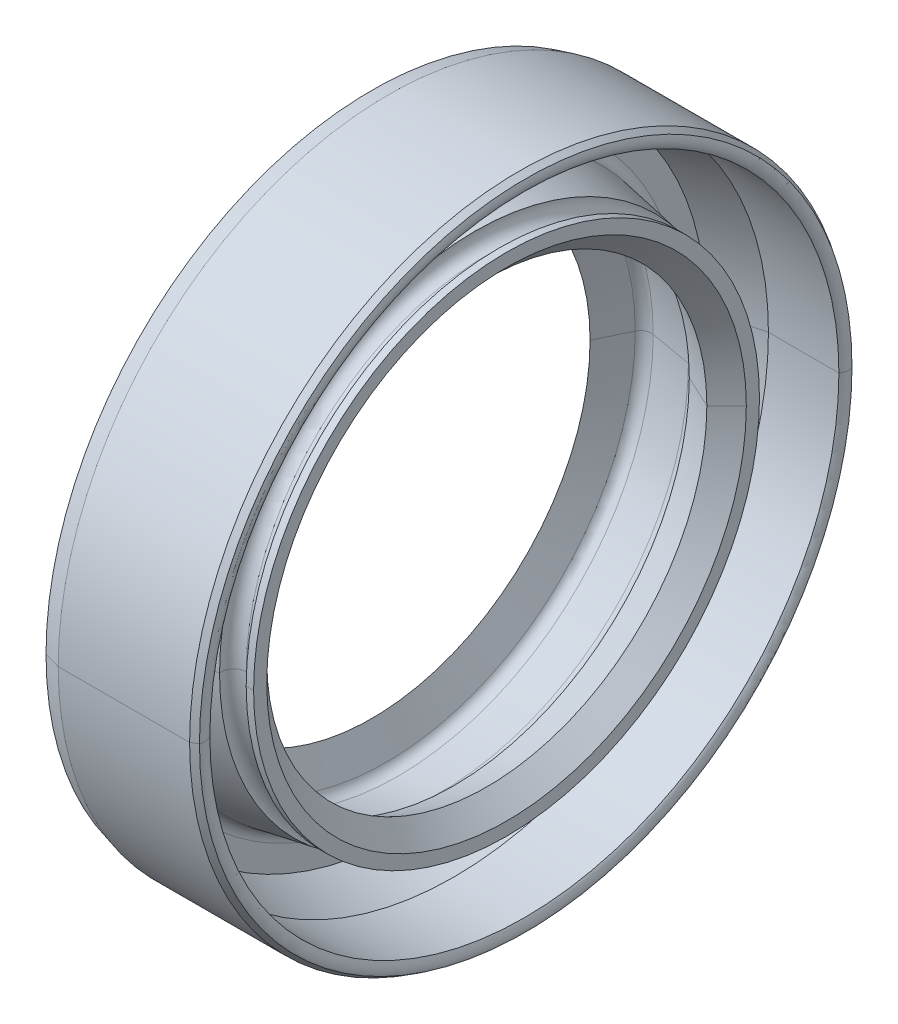
ISO-10303-21;
HEADER;
FILE_DESCRIPTION(('STEP AP214'),'2;1');
FILE_NAME('part.step','',(''),(''),'','','');
FILE_SCHEMA(('AUTOMOTIVE_DESIGN { 1 0 10303 214 1 1 1 1 }'));
ENDSEC;
DATA;
#1=APPLICATION_CONTEXT('core data for automotive mechanical design processes');
#2=APPLICATION_PROTOCOL_DEFINITION('international standard','automotive_design',2000,#1);
#3=PRODUCT_CONTEXT('',#1,'mechanical');
#4=PRODUCT('Part','Part','',(#3));
#5=PRODUCT_RELATED_PRODUCT_CATEGORY('part','',(#4));
#6=PRODUCT_DEFINITION_FORMATION('','',#4);
#7=PRODUCT_DEFINITION_CONTEXT('part definition',#1,'design');
#8=PRODUCT_DEFINITION('design','',#6,#7);
#9=PRODUCT_DEFINITION_SHAPE('','',#8);
#10=(LENGTH_UNIT() NAMED_UNIT(*) SI_UNIT(.MILLI.,.METRE.));
#11=(NAMED_UNIT(*) PLANE_ANGLE_UNIT() SI_UNIT($,.RADIAN.));
#12=(NAMED_UNIT(*) SI_UNIT($,.STERADIAN.) SOLID_ANGLE_UNIT());
#13=UNCERTAINTY_MEASURE_WITH_UNIT(LENGTH_MEASURE(1.E-05),#10,'distance_accuracy_value','');
#14=(GEOMETRIC_REPRESENTATION_CONTEXT(3) GLOBAL_UNCERTAINTY_ASSIGNED_CONTEXT((#13)) GLOBAL_UNIT_ASSIGNED_CONTEXT((#10,
#11,#12)) REPRESENTATION_CONTEXT('',''));
#15=CARTESIAN_POINT('',(0.,0.,0.));
#16=DIRECTION('',(0.,0.,1.));
#17=DIRECTION('',(1.,0.,0.));
#18=AXIS2_PLACEMENT_3D('',#15,#16,#17);
#19=CARTESIAN_POINT('',(0.752354754295494,0.,0.));
#20=DIRECTION('',(1.,0.,0.));
#21=DIRECTION('',(0.,0.,-1.));
#22=AXIS2_PLACEMENT_3D('',#19,#20,#21);
#23=CONICAL_SURFACE('',#22,15.,0.260113068736245);
#24=DIRECTION('',(0.966360904184034,0.,0.257189818742141));
#25=VECTOR('',#24,1.);
#26=CARTESIAN_POINT('',(0.752354754295494,0.,15.));
#27=LINE('',#26,#25);
#28=CARTESIAN_POINT('',(0.,0.,14.7997663377634));
#29=VERTEX_POINT('',#28);
#30=CARTESIAN_POINT('',(0.752354754295494,0.,15.));
#31=VERTEX_POINT('',#30);
#32=EDGE_CURVE('E222',#29,#31,#27,.T.);
#33=ORIENTED_EDGE('',*,*,#32,.F.);
#34=CARTESIAN_POINT('',(0.,0.,0.));
#35=DIRECTION('',(-1.,0.,0.));
#36=DIRECTION('',(0.,0.,1.));
#37=AXIS2_PLACEMENT_3D('',#34,#35,#36);
#38=CIRCLE('',#37,14.7997663377634);
#39=CARTESIAN_POINT('',(0.,0.,-14.7997663377634));
#40=VERTEX_POINT('',#39);
#41=EDGE_CURVE('E11',#40,#29,#38,.T.);
#42=ORIENTED_EDGE('',*,*,#41,.F.);
#43=DIRECTION('',(0.966360904184034,0.,-0.257189818742141));
#44=VECTOR('',#43,1.);
#45=CARTESIAN_POINT('',(0.752354754295494,0.,-15.));
#46=LINE('',#45,#44);
#47=CARTESIAN_POINT('',(0.752354754295494,0.,-15.));
#48=VERTEX_POINT('',#47);
#49=EDGE_CURVE('E396',#40,#48,#46,.T.);
#50=ORIENTED_EDGE('',*,*,#49,.T.);
#51=CARTESIAN_POINT('',(0.752354754295494,0.,0.));
#52=DIRECTION('',(-1.,0.,0.));
#53=DIRECTION('',(0.,0.,1.));
#54=AXIS2_PLACEMENT_3D('',#51,#52,#53);
#55=CIRCLE('',#54,15.);
#56=EDGE_CURVE('E315',#48,#31,#55,.T.);
#57=ORIENTED_EDGE('',*,*,#56,.T.);
#58=EDGE_LOOP('',(#33,#42,#50,#57));
#59=FACE_BOUND('',#58,.T.);
#60=ADVANCED_FACE('F17',(#59),#23,.T.);
#61=CARTESIAN_POINT('',(0.,0.,-14.7997663377634));
#62=DIRECTION('',(1.,0.,0.));
#63=DIRECTION('',(0.,1.,0.));
#64=AXIS2_PLACEMENT_3D('',#61,#62,#63);
#65=PLANE('',#64);
#66=CARTESIAN_POINT('',(0.,0.,0.));
#67=DIRECTION('',(-1.,0.,0.));
#68=DIRECTION('',(0.,0.,1.));
#69=AXIS2_PLACEMENT_3D('',#66,#67,#68);
#70=CIRCLE('',#69,9.92474243623592);
#71=CARTESIAN_POINT('',(0.,0.,-9.92474243623592));
#72=VERTEX_POINT('',#71);
#73=CARTESIAN_POINT('',(0.,0.,9.92474243623592));
#74=VERTEX_POINT('',#73);
#75=EDGE_CURVE('E372',#72,#74,#70,.T.);
#76=ORIENTED_EDGE('',*,*,#75,.F.);
#77=CARTESIAN_POINT('',(0.,0.,0.));
#78=DIRECTION('',(-1.,0.,0.));
#79=DIRECTION('',(0.,0.,1.));
#80=AXIS2_PLACEMENT_3D('',#77,#78,#79);
#81=CIRCLE('',#80,9.92474243623592);
#82=EDGE_CURVE('E28',#74,#72,#81,.T.);
#83=ORIENTED_EDGE('',*,*,#82,.F.);
#84=EDGE_LOOP('',(#76,#83));
#85=FACE_BOUND('',#84,.T.);
#86=ORIENTED_EDGE('',*,*,#41,.T.);
#87=CARTESIAN_POINT('',(0.,0.,0.));
#88=DIRECTION('',(-1.,0.,0.));
#89=DIRECTION('',(0.,0.,1.));
#90=AXIS2_PLACEMENT_3D('',#87,#88,#89);
#91=CIRCLE('',#90,14.7997663377634);
#92=EDGE_CURVE('E227',#29,#40,#91,.T.);
#93=ORIENTED_EDGE('',*,*,#92,.T.);
#94=EDGE_LOOP('',(#86,#93));
#95=FACE_BOUND('',#94,.T.);
#96=ADVANCED_FACE('F514',(#85,#95),#65,.F.);
#97=CARTESIAN_POINT('',(0.,0.,0.));
#98=DIRECTION('',(1.,0.,0.));
#99=DIRECTION('',(0.,0.,-1.));
#100=AXIS2_PLACEMENT_3D('',#97,#98,#99);
#101=CONICAL_SURFACE('',#100,9.92474243623592,1.1278205147707);
#102=DIRECTION('',(0.428629946027667,0.,0.903480143317117));
#103=VECTOR('',#102,1.);
#104=CARTESIAN_POINT('',(0.,0.,9.92474243623592));
#105=LINE('',#104,#103);
#106=CARTESIAN_POINT('',(0.659888848220738,0.,11.3156776163116));
#107=VERTEX_POINT('',#106);
#108=EDGE_CURVE('E368',#74,#107,#105,.T.);
#109=ORIENTED_EDGE('',*,*,#108,.F.);
#110=ORIENTED_EDGE('',*,*,#82,.T.);
#111=DIRECTION('',(0.428629946027667,0.,-0.903480143317117));
#112=VECTOR('',#111,1.);
#113=CARTESIAN_POINT('',(0.,0.,-9.92474243623592));
#114=LINE('',#113,#112);
#115=CARTESIAN_POINT('',(0.659888848220738,0.,-11.3156776163116));
#116=VERTEX_POINT('',#115);
#117=EDGE_CURVE('E236',#72,#116,#114,.T.);
#118=ORIENTED_EDGE('',*,*,#117,.T.);
#119=CARTESIAN_POINT('',(0.659888848220738,0.,0.));
#120=DIRECTION('',(-1.,0.,0.));
#121=DIRECTION('',(0.,0.,1.));
#122=AXIS2_PLACEMENT_3D('',#119,#120,#121);
#123=CIRCLE('',#122,11.3156776163116);
#124=EDGE_CURVE('E367',#107,#116,#123,.T.);
#125=ORIENTED_EDGE('',*,*,#124,.F.);
#126=EDGE_LOOP('',(#109,#110,#118,#125));
#127=FACE_BOUND('',#126,.T.);
#128=ADVANCED_FACE('F512',(#127),#101,.F.);
#129=CARTESIAN_POINT('',(1.1116289198793,0.,0.));
#130=DIRECTION('',(-1.,0.,0.));
#131=DIRECTION('',(0.,0.,1.));
#132=AXIS2_PLACEMENT_3D('',#129,#130,#131);
#133=TOROIDAL_SURFACE('',#132,11.1013626432978,0.5);
#134=CARTESIAN_POINT('',(1.1116289198793,0.,-11.1013626432978));
#135=DIRECTION('',(0.,1.,0.));
#136=DIRECTION('',(0.,0.,1.));
#137=AXIS2_PLACEMENT_3D('',#134,#135,#136);
#138=CIRCLE('',#137,0.5);
#139=CARTESIAN_POINT('',(1.19845300871272,0.,-11.5937665198039));
#140=VERTEX_POINT('',#139);
#141=EDGE_CURVE('E235',#140,#116,#138,.T.);
#142=ORIENTED_EDGE('',*,*,#141,.F.);
#143=CARTESIAN_POINT('',(1.19845300871272,0.,0.));
#144=DIRECTION('',(-1.,0.,0.));
#145=DIRECTION('',(0.,0.,1.));
#146=AXIS2_PLACEMENT_3D('',#143,#144,#145);
#147=CIRCLE('',#146,11.5937665198039);
#148=CARTESIAN_POINT('',(1.19845300871272,0.,11.5937665198039));
#149=VERTEX_POINT('',#148);
#150=EDGE_CURVE('E363',#149,#140,#147,.T.);
#151=ORIENTED_EDGE('',*,*,#150,.F.);
#152=CARTESIAN_POINT('',(1.1116289198793,0.,11.1013626432978));
#153=DIRECTION('',(0.,-1.,0.));
#154=DIRECTION('',(0.,0.,-1.));
#155=AXIS2_PLACEMENT_3D('',#152,#153,#154);
#156=CIRCLE('',#155,0.5);
#157=EDGE_CURVE('E215',#149,#107,#156,.T.);
#158=ORIENTED_EDGE('',*,*,#157,.T.);
#159=ORIENTED_EDGE('',*,*,#124,.T.);
#160=EDGE_LOOP('',(#142,#151,#158,#159));
#161=FACE_BOUND('',#160,.T.);
#162=ADVANCED_FACE('F497',(#161),#133,.F.);
#163=CARTESIAN_POINT('',(1.19845300871272,0.,0.));
#164=DIRECTION('',(-1.,0.,0.));
#165=DIRECTION('',(0.,0.,1.));
#166=AXIS2_PLACEMENT_3D('',#163,#164,#165);
#167=CONICAL_SURFACE('',#166,11.5937665198039,0.17453292519935);
#168=DIRECTION('',(-0.984807753012222,0.,-0.173648177666849));
#169=VECTOR('',#168,1.);
#170=CARTESIAN_POINT('',(1.19845300871272,0.,-11.5937665198039));
#171=LINE('',#170,#169);
#172=CARTESIAN_POINT('',(3.14131146181692,0.,-11.2511881548243));
#173=VERTEX_POINT('',#172);
#174=EDGE_CURVE('E214',#173,#140,#171,.T.);
#175=ORIENTED_EDGE('',*,*,#174,.F.);
#176=CARTESIAN_POINT('',(3.14131146181692,0.,0.));
#177=DIRECTION('',(-1.,0.,0.));
#178=DIRECTION('',(0.,0.,1.));
#179=AXIS2_PLACEMENT_3D('',#176,#177,#178);
#180=CIRCLE('',#179,11.2511881548243);
#181=CARTESIAN_POINT('',(3.14131146181692,0.,11.2511881548243));
#182=VERTEX_POINT('',#181);
#183=EDGE_CURVE('E327',#182,#173,#180,.T.);
#184=ORIENTED_EDGE('',*,*,#183,.F.);
#185=DIRECTION('',(-0.984807753012222,0.,0.173648177666849));
#186=VECTOR('',#185,1.);
#187=CARTESIAN_POINT('',(1.19845300871272,0.,11.5937665198039));
#188=LINE('',#187,#186);
#189=EDGE_CURVE('E328',#182,#149,#188,.T.);
#190=ORIENTED_EDGE('',*,*,#189,.T.);
#191=ORIENTED_EDGE('',*,*,#150,.T.);
#192=EDGE_LOOP('',(#175,#184,#190,#191));
#193=FACE_BOUND('',#192,.T.);
#194=ADVANCED_FACE('F487',(#193),#167,.F.);
#195=CARTESIAN_POINT('',(3.01154726943575,0.,0.));
#196=DIRECTION('',(-1.,0.,0.));
#197=DIRECTION('',(0.,0.,1.));
#198=AXIS2_PLACEMENT_3D('',#195,#196,#197);
#199=TOROIDAL_SURFACE('',#198,10.5152588497367,0.747282200852594);
#200=CARTESIAN_POINT('',(3.01154726943575,0.,-10.5152588497367));
#201=DIRECTION('',(0.,1.,0.));
#202=DIRECTION('',(0.,0.,1.));
#203=AXIS2_PLACEMENT_3D('',#200,#201,#202);
#204=CIRCLE('',#203,0.747282200852594);
#205=CARTESIAN_POINT('',(3.73641100426286,0.,-10.696926826121));
#206=VERTEX_POINT('',#205);
#207=EDGE_CURVE('E392',#206,#173,#204,.T.);
#208=ORIENTED_EDGE('',*,*,#207,.F.);
#209=CARTESIAN_POINT('',(3.73641100426286,0.,0.));
#210=DIRECTION('',(-1.,0.,0.));
#211=DIRECTION('',(0.,0.,1.));
#212=AXIS2_PLACEMENT_3D('',#209,#210,#211);
#213=CIRCLE('',#212,10.696926826121);
#214=CARTESIAN_POINT('',(3.73641100426286,0.,10.696926826121));
#215=VERTEX_POINT('',#214);
#216=EDGE_CURVE('E324',#215,#206,#213,.T.);
#217=ORIENTED_EDGE('',*,*,#216,.F.);
#218=CARTESIAN_POINT('',(3.01154726943575,0.,10.5152588497367));
#219=DIRECTION('',(0.,-1.,0.));
#220=DIRECTION('',(0.,0.,-1.));
#221=AXIS2_PLACEMENT_3D('',#218,#219,#220);
#222=CIRCLE('',#221,0.747282200852594);
#223=EDGE_CURVE('E300',#215,#182,#222,.T.);
#224=ORIENTED_EDGE('',*,*,#223,.T.);
#225=ORIENTED_EDGE('',*,*,#183,.T.);
#226=EDGE_LOOP('',(#208,#217,#224,#225));
#227=FACE_BOUND('',#226,.T.);
#228=ADVANCED_FACE('F549',(#227),#199,.F.);
#229=CARTESIAN_POINT('',(3.73641100426286,0.,0.));
#230=DIRECTION('',(-1.,0.,0.));
#231=DIRECTION('',(0.,0.,1.));
#232=AXIS2_PLACEMENT_3D('',#229,#230,#231);
#233=CONICAL_SURFACE('',#232,10.696926826121,0.436332312998609);
#234=DIRECTION('',(-0.906307787036639,0.,-0.422618261740724));
#235=VECTOR('',#234,1.);
#236=CARTESIAN_POINT('',(3.73641100426286,0.,-10.696926826121));
#237=LINE('',#236,#235);
#238=CARTESIAN_POINT('',(5.23097540596805,0.,-10.));
#239=VERTEX_POINT('',#238);
#240=EDGE_CURVE('E21',#239,#206,#237,.T.);
#241=ORIENTED_EDGE('',*,*,#240,.F.);
#242=CARTESIAN_POINT('',(5.23097540596805,0.,0.));
#243=DIRECTION('',(-1.,0.,0.));
#244=DIRECTION('',(0.,0.,1.));
#245=AXIS2_PLACEMENT_3D('',#242,#243,#244);
#246=CIRCLE('',#245,10.);
#247=CARTESIAN_POINT('',(5.23097540596805,0.,10.));
#248=VERTEX_POINT('',#247);
#249=EDGE_CURVE('E185',#248,#239,#246,.T.);
#250=ORIENTED_EDGE('',*,*,#249,.F.);
#251=DIRECTION('',(-0.906307787036639,0.,0.422618261740724));
#252=VECTOR('',#251,1.);
#253=CARTESIAN_POINT('',(3.73641100426286,0.,10.696926826121));
#254=LINE('',#253,#252);
#255=EDGE_CURVE('E206',#248,#215,#254,.T.);
#256=ORIENTED_EDGE('',*,*,#255,.T.);
#257=ORIENTED_EDGE('',*,*,#216,.T.);
#258=EDGE_LOOP('',(#241,#250,#256,#257));
#259=FACE_BOUND('',#258,.T.);
#260=ADVANCED_FACE('F552',(#259),#233,.F.);
#261=CARTESIAN_POINT('',(5.23097540596805,0.,0.));
#262=DIRECTION('',(1.,0.,0.));
#263=DIRECTION('',(0.,0.,-1.));
#264=AXIS2_PLACEMENT_3D('',#261,#262,#263);
#265=CONICAL_SURFACE('',#264,10.,0.785398163397414);
#266=DIRECTION('',(0.707106781186572,0.,0.707106781186523));
#267=VECTOR('',#266,1.);
#268=CARTESIAN_POINT('',(5.23097540596805,0.,10.));
#269=LINE('',#268,#267);
#270=CARTESIAN_POINT('',(6.1277140469912,0.,10.8967386410231));
#271=VERTEX_POINT('',#270);
#272=EDGE_CURVE('E198',#248,#271,#269,.T.);
#273=ORIENTED_EDGE('',*,*,#272,.F.);
#274=ORIENTED_EDGE('',*,*,#249,.T.);
#275=DIRECTION('',(0.707106781186572,0.,-0.707106781186523));
#276=VECTOR('',#275,1.);
#277=CARTESIAN_POINT('',(5.23097540596805,0.,-10.));
#278=LINE('',#277,#276);
#279=CARTESIAN_POINT('',(6.1277140469912,0.,-10.8967386410231));
#280=VERTEX_POINT('',#279);
#281=EDGE_CURVE('E189',#239,#280,#278,.T.);
#282=ORIENTED_EDGE('',*,*,#281,.T.);
#283=CARTESIAN_POINT('',(6.1277140469912,0.,0.));
#284=DIRECTION('',(-1.,0.,0.));
#285=DIRECTION('',(0.,0.,1.));
#286=AXIS2_PLACEMENT_3D('',#283,#284,#285);
#287=CIRCLE('',#286,10.8967386410231);
#288=EDGE_CURVE('E175',#271,#280,#287,.T.);
#289=ORIENTED_EDGE('',*,*,#288,.F.);
#290=EDGE_LOOP('',(#273,#274,#282,#289));
#291=FACE_BOUND('',#290,.T.);
#292=ADVANCED_FACE('F190',(#291),#265,.F.);
#293=CARTESIAN_POINT('',(6.1277140469912,0.,-10.8967386410231));
#294=DIRECTION('',(-1.,0.,0.));
#295=DIRECTION('',(0.,0.,1.));
#296=AXIS2_PLACEMENT_3D('',#293,#294,#295);
#297=PLANE('',#296);
#298=CARTESIAN_POINT('',(6.1277140469912,0.,0.));
#299=DIRECTION('',(-1.,0.,0.));
#300=DIRECTION('',(0.,0.,1.));
#301=AXIS2_PLACEMENT_3D('',#298,#299,#300);
#302=CIRCLE('',#301,10.8967386410231);
#303=EDGE_CURVE('E180',#280,#271,#302,.T.);
#304=ORIENTED_EDGE('',*,*,#303,.T.);
#305=ORIENTED_EDGE('',*,*,#288,.T.);
#306=EDGE_LOOP('',(#304,#305));
#307=FACE_BOUND('',#306,.T.);
#308=CARTESIAN_POINT('',(6.1277140469912,0.,0.));
#309=DIRECTION('',(-1.,0.,0.));
#310=DIRECTION('',(0.,0.,1.));
#311=AXIS2_PLACEMENT_3D('',#308,#309,#310);
#312=CIRCLE('',#311,11.494564401705);
#313=CARTESIAN_POINT('',(6.1277140469912,0.,11.494564401705));
#314=VERTEX_POINT('',#313);
#315=CARTESIAN_POINT('',(6.1277140469912,0.,-11.494564401705));
#316=VERTEX_POINT('',#315);
#317=EDGE_CURVE('E195',#314,#316,#312,.T.);
#318=ORIENTED_EDGE('',*,*,#317,.F.);
#319=CARTESIAN_POINT('',(6.1277140469912,0.,0.));
#320=DIRECTION('',(-1.,0.,0.));
#321=DIRECTION('',(0.,0.,1.));
#322=AXIS2_PLACEMENT_3D('',#319,#320,#321);
#323=CIRCLE('',#322,11.494564401705);
#324=EDGE_CURVE('E186',#316,#314,#323,.T.);
#325=ORIENTED_EDGE('',*,*,#324,.F.);
#326=EDGE_LOOP('',(#318,#325));
#327=FACE_BOUND('',#326,.T.);
#328=ADVANCED_FACE('F177',(#307,#327),#297,.F.);
#329=CARTESIAN_POINT('',(-19.4565940720075,0.,0.));
#330=DIRECTION('',(-1.,0.,0.));
#331=DIRECTION('',(0.,0.,1.));
#332=AXIS2_PLACEMENT_3D('',#329,#330,#331);
#333=CYLINDRICAL_SURFACE('',#332,11.494564401705);
#334=DIRECTION('',(-1.,0.,0.));
#335=VECTOR('',#334,1.);
#336=CARTESIAN_POINT('',(-19.4565940720075,0.,-11.494564401705));
#337=LINE('',#336,#335);
#338=CARTESIAN_POINT('',(5.7914370566075,0.,-11.4945644017061));
#339=VERTEX_POINT('',#338);
#340=EDGE_CURVE('E242',#316,#339,#337,.T.);
#341=ORIENTED_EDGE('',*,*,#340,.F.);
#342=ORIENTED_EDGE('',*,*,#324,.T.);
#343=DIRECTION('',(-1.,0.,0.));
#344=VECTOR('',#343,1.);
#345=CARTESIAN_POINT('',(-19.4565940720075,0.,11.494564401705));
#346=LINE('',#345,#344);
#347=CARTESIAN_POINT('',(5.7914370566075,0.,11.4945644017061));
#348=VERTEX_POINT('',#347);
#349=EDGE_CURVE('E241',#314,#348,#346,.T.);
#350=ORIENTED_EDGE('',*,*,#349,.T.);
#351=CARTESIAN_POINT('',(5.7914370566075,0.,0.));
#352=DIRECTION('',(-1.,0.,0.));
#353=DIRECTION('',(0.,0.,1.));
#354=AXIS2_PLACEMENT_3D('',#351,#352,#353);
#355=CIRCLE('',#354,11.494564401705);
#356=EDGE_CURVE('E340',#339,#348,#355,.T.);
#357=ORIENTED_EDGE('',*,*,#356,.F.);
#358=EDGE_LOOP('',(#341,#342,#350,#357));
#359=FACE_BOUND('',#358,.T.);
#360=ADVANCED_FACE('F606',(#359),#333,.T.);
#361=CARTESIAN_POINT('',(5.23088228864806,0.,0.));
#362=DIRECTION('',(-1.,0.,0.));
#363=DIRECTION('',(0.,0.,1.));
#364=AXIS2_PLACEMENT_3D('',#361,#362,#363);
#365=TOROIDAL_SURFACE('',#364,11.4935145071604,0.56055575116185);
#366=CARTESIAN_POINT('',(5.23088228864806,0.,0.));
#367=DIRECTION('',(-1.,0.,0.));
#368=DIRECTION('',(0.,0.,1.));
#369=AXIS2_PLACEMENT_3D('',#366,#367,#368);
#370=CIRCLE('',#369,10.9329587559985);
#371=CARTESIAN_POINT('',(5.23088228864806,0.,10.9329587559985));
#372=VERTEX_POINT('',#371);
#373=CARTESIAN_POINT('',(5.23088228864806,0.,-10.9329587559985));
#374=VERTEX_POINT('',#373);
#375=EDGE_CURVE('E273',#372,#374,#370,.T.);
#376=ORIENTED_EDGE('',*,*,#375,.F.);
#377=CARTESIAN_POINT('',(5.23088228864806,0.,11.4935145071604));
#378=DIRECTION('',(0.,-1.,0.));
#379=DIRECTION('',(0.,0.,-1.));
#380=AXIS2_PLACEMENT_3D('',#377,#378,#379);
#381=CIRCLE('',#380,0.560555751161849);
#382=EDGE_CURVE('E210',#372,#348,#381,.T.);
#383=ORIENTED_EDGE('',*,*,#382,.T.);
#384=CARTESIAN_POINT('',(5.7914370566075,0.,0.));
#385=DIRECTION('',(-1.,0.,0.));
#386=DIRECTION('',(0.,0.,1.));
#387=AXIS2_PLACEMENT_3D('',#384,#385,#386);
#388=CIRCLE('',#387,11.494564401705);
#389=EDGE_CURVE('E237',#348,#339,#388,.T.);
#390=ORIENTED_EDGE('',*,*,#389,.T.);
#391=CARTESIAN_POINT('',(5.23088228864806,0.,-11.4935145071604));
#392=DIRECTION('',(0.,1.,0.));
#393=DIRECTION('',(0.,0.,1.));
#394=AXIS2_PLACEMENT_3D('',#391,#392,#393);
#395=CIRCLE('',#394,0.560555751161849);
#396=EDGE_CURVE('E344',#374,#339,#395,.T.);
#397=ORIENTED_EDGE('',*,*,#396,.F.);
#398=EDGE_LOOP('',(#376,#383,#390,#397));
#399=FACE_BOUND('',#398,.T.);
#400=ADVANCED_FACE('F557',(#399),#365,.F.);
#401=CARTESIAN_POINT('',(4.6792624358679,0.,0.));
#402=DIRECTION('',(-1.,0.,0.));
#403=DIRECTION('',(0.,0.,1.));
#404=AXIS2_PLACEMENT_3D('',#401,#402,#403);
#405=CONICAL_SURFACE('',#404,11.5932054705393,0.174532925199549);
#406=DIRECTION('',(-0.984807753012188,0.,-0.173648177667046));
#407=VECTOR('',#406,1.);
#408=CARTESIAN_POINT('',(4.6792624358679,0.,-11.5932054705393));
#409=LINE('',#408,#407);
#410=CARTESIAN_POINT('',(4.6792624358679,0.,-11.5932054705393));
#411=VERTEX_POINT('',#410);
#412=CARTESIAN_POINT('',(1.93564869347058,0.,-12.0769785979668));
#413=VERTEX_POINT('',#412);
#414=EDGE_CURVE('E252',#411,#413,#409,.T.);
#415=ORIENTED_EDGE('',*,*,#414,.F.);
#416=CARTESIAN_POINT('',(4.6792624358679,0.,0.));
#417=DIRECTION('',(-1.,0.,0.));
#418=DIRECTION('',(0.,0.,1.));
#419=AXIS2_PLACEMENT_3D('',#416,#417,#418);
#420=CIRCLE('',#419,11.5932054705393);
#421=CARTESIAN_POINT('',(4.6792624358679,0.,11.5932054705393));
#422=VERTEX_POINT('',#421);
#423=EDGE_CURVE('E263',#411,#422,#420,.T.);
#424=ORIENTED_EDGE('',*,*,#423,.T.);
#425=DIRECTION('',(-0.984807753012188,0.,0.173648177667046));
#426=VECTOR('',#425,1.);
#427=CARTESIAN_POINT('',(4.6792624358679,0.,11.5932054705393));
#428=LINE('',#427,#426);
#429=CARTESIAN_POINT('',(1.93564869347058,0.,12.0769785979668));
#430=VERTEX_POINT('',#429);
#431=EDGE_CURVE('E251',#422,#430,#428,.T.);
#432=ORIENTED_EDGE('',*,*,#431,.T.);
#433=CARTESIAN_POINT('',(1.93564869347058,0.,0.));
#434=DIRECTION('',(-1.,0.,0.));
#435=DIRECTION('',(0.,0.,1.));
#436=AXIS2_PLACEMENT_3D('',#433,#434,#435);
#437=CIRCLE('',#436,12.0769785979668);
#438=EDGE_CURVE('E221',#413,#430,#437,.T.);
#439=ORIENTED_EDGE('',*,*,#438,.F.);
#440=EDGE_LOOP('',(#415,#424,#432,#439));
#441=FACE_BOUND('',#440,.T.);
#442=ADVANCED_FACE('F553',(#441),#405,.T.);
#443=CARTESIAN_POINT('',(2.02833740231413,0.,0.));
#444=DIRECTION('',(-1.,0.,0.));
#445=DIRECTION('',(0.,0.,1.));
#446=AXIS2_PLACEMENT_3D('',#443,#444,#445);
#447=TOROIDAL_SURFACE('',#446,12.6026423873148,0.5337730006088);
#448=CARTESIAN_POINT('',(2.02833740231413,0.,-12.6026423873148));
#449=DIRECTION('',(0.,1.,0.));
#450=DIRECTION('',(0.,0.,1.));
#451=AXIS2_PLACEMENT_3D('',#448,#449,#450);
#452=CIRCLE('',#451,0.533773000608801);
#453=CARTESIAN_POINT('',(1.49456440170533,0.,-12.602642387315));
#454=VERTEX_POINT('',#453);
#455=EDGE_CURVE('E304',#454,#413,#452,.T.);
#456=ORIENTED_EDGE('',*,*,#455,.F.);
#457=CARTESIAN_POINT('',(1.49456440170533,0.,0.));
#458=DIRECTION('',(-1.,0.,0.));
#459=DIRECTION('',(0.,0.,1.));
#460=AXIS2_PLACEMENT_3D('',#457,#458,#459);
#461=CIRCLE('',#460,12.6026423873152);
#462=CARTESIAN_POINT('',(1.49456440170533,0.,12.602642387315));
#463=VERTEX_POINT('',#462);
#464=EDGE_CURVE('E322',#463,#454,#461,.T.);
#465=ORIENTED_EDGE('',*,*,#464,.F.);
#466=CARTESIAN_POINT('',(2.02833740231413,0.,12.6026423873148));
#467=DIRECTION('',(0.,-1.,0.));
#468=DIRECTION('',(0.,0.,-1.));
#469=AXIS2_PLACEMENT_3D('',#466,#467,#468);
#470=CIRCLE('',#469,0.533773000608801);
#471=EDGE_CURVE('E217',#463,#430,#470,.T.);
#472=ORIENTED_EDGE('',*,*,#471,.T.);
#473=CARTESIAN_POINT('',(1.93564869347058,0.,0.));
#474=DIRECTION('',(-1.,0.,0.));
#475=DIRECTION('',(0.,0.,1.));
#476=AXIS2_PLACEMENT_3D('',#473,#474,#475);
#477=CIRCLE('',#476,12.0769785979668);
#478=EDGE_CURVE('E247',#430,#413,#477,.T.);
#479=ORIENTED_EDGE('',*,*,#478,.T.);
#480=EDGE_LOOP('',(#456,#465,#472,#479));
#481=FACE_BOUND('',#480,.T.);
#482=ADVANCED_FACE('F556',(#481),#447,.F.);
#483=CARTESIAN_POINT('',(1.49456440170531,0.,-13.6921931247855));
#484=DIRECTION('',(-1.,0.,0.));
#485=DIRECTION('',(0.,0.,1.));
#486=AXIS2_PLACEMENT_3D('',#483,#484,#485);
#487=PLANE('',#486);
#488=ORIENTED_EDGE('',*,*,#464,.T.);
#489=CARTESIAN_POINT('',(1.49456440170533,0.,0.));
#490=DIRECTION('',(-1.,0.,0.));
#491=DIRECTION('',(0.,0.,1.));
#492=AXIS2_PLACEMENT_3D('',#489,#490,#491);
#493=CIRCLE('',#492,12.6026423873152);
#494=EDGE_CURVE('E285',#454,#463,#493,.T.);
#495=ORIENTED_EDGE('',*,*,#494,.T.);
#496=EDGE_LOOP('',(#488,#495));
#497=FACE_BOUND('',#496,.T.);
#498=CARTESIAN_POINT('',(1.4945644017053,0.,0.));
#499=DIRECTION('',(-1.,0.,0.));
#500=DIRECTION('',(0.,0.,1.));
#501=AXIS2_PLACEMENT_3D('',#498,#499,#500);
#502=CIRCLE('',#501,13.6921931247855);
#503=CARTESIAN_POINT('',(1.4945644017053,0.,-13.6921931247855));
#504=VERTEX_POINT('',#503);
#505=CARTESIAN_POINT('',(1.4945644017053,0.,13.6921931247855));
#506=VERTEX_POINT('',#505);
#507=EDGE_CURVE('E220',#504,#506,#502,.T.);
#508=ORIENTED_EDGE('',*,*,#507,.F.);
#509=CARTESIAN_POINT('',(1.4945644017053,0.,0.));
#510=DIRECTION('',(-1.,0.,0.));
#511=DIRECTION('',(0.,0.,1.));
#512=AXIS2_PLACEMENT_3D('',#509,#510,#511);
#513=CIRCLE('',#512,13.6921931247855);
#514=EDGE_CURVE('E345',#506,#504,#513,.T.);
#515=ORIENTED_EDGE('',*,*,#514,.F.);
#516=EDGE_LOOP('',(#508,#515));
#517=FACE_BOUND('',#516,.T.);
#518=ADVANCED_FACE('F589',(#497,#517),#487,.F.);
#519=CARTESIAN_POINT('',(1.4945644017053,0.,0.));
#520=DIRECTION('',(1.,0.,0.));
#521=DIRECTION('',(0.,0.,-1.));
#522=AXIS2_PLACEMENT_3D('',#519,#520,#521);
#523=CONICAL_SURFACE('',#522,13.6921931247855,0.261799387799077);
#524=DIRECTION('',(0.965925826289087,0.,0.25881904510245));
#525=VECTOR('',#524,1.);
#526=CARTESIAN_POINT('',(1.4945644017053,0.,13.6921931247855));
#527=LINE('',#526,#525);
#528=CARTESIAN_POINT('',(3.73641100426317,0.,14.2928941114952));
#529=VERTEX_POINT('',#528);
#530=EDGE_CURVE('E316',#506,#529,#527,.T.);
#531=ORIENTED_EDGE('',*,*,#530,.F.);
#532=ORIENTED_EDGE('',*,*,#514,.T.);
#533=DIRECTION('',(0.965925826289087,0.,-0.25881904510245));
#534=VECTOR('',#533,1.);
#535=CARTESIAN_POINT('',(1.4945644017053,0.,-13.6921931247855));
#536=LINE('',#535,#534);
#537=CARTESIAN_POINT('',(3.73641100426317,0.,-14.2928941114952));
#538=VERTEX_POINT('',#537);
#539=EDGE_CURVE('E258',#504,#538,#536,.T.);
#540=ORIENTED_EDGE('',*,*,#539,.T.);
#541=CARTESIAN_POINT('',(3.73641100426317,0.,0.));
#542=DIRECTION('',(-1.,0.,0.));
#543=DIRECTION('',(0.,0.,1.));
#544=AXIS2_PLACEMENT_3D('',#541,#542,#543);
#545=CIRCLE('',#544,14.2928941114952);
#546=EDGE_CURVE('E314',#529,#538,#545,.T.);
#547=ORIENTED_EDGE('',*,*,#546,.F.);
#548=EDGE_LOOP('',(#531,#532,#540,#547));
#549=FACE_BOUND('',#548,.T.);
#550=ADVANCED_FACE('F585',(#549),#523,.F.);
#551=CARTESIAN_POINT('',(-19.4565940720075,0.,0.));
#552=DIRECTION('',(-1.,0.,0.));
#553=DIRECTION('',(0.,0.,1.));
#554=AXIS2_PLACEMENT_3D('',#551,#552,#553);
#555=CYLINDRICAL_SURFACE('',#554,14.2928941114951);
#556=DIRECTION('',(-1.,0.,0.));
#557=VECTOR('',#556,1.);
#558=CARTESIAN_POINT('',(-19.4565940720075,0.,-14.2928941114951));
#559=LINE('',#558,#557);
#560=CARTESIAN_POINT('',(6.93904900791708,0.,-14.2928941114951));
#561=VERTEX_POINT('',#560);
#562=EDGE_CURVE('E257',#561,#538,#559,.T.);
#563=ORIENTED_EDGE('',*,*,#562,.F.);
#564=CARTESIAN_POINT('',(6.93904900791708,0.,0.));
#565=DIRECTION('',(-1.,0.,0.));
#566=DIRECTION('',(0.,0.,1.));
#567=AXIS2_PLACEMENT_3D('',#564,#565,#566);
#568=CIRCLE('',#567,14.2928941114951);
#569=CARTESIAN_POINT('',(6.93904900791708,0.,14.2928941114951));
#570=VERTEX_POINT('',#569);
#571=EDGE_CURVE('E286',#570,#561,#568,.T.);
#572=ORIENTED_EDGE('',*,*,#571,.F.);
#573=DIRECTION('',(-1.,0.,0.));
#574=VECTOR('',#573,1.);
#575=CARTESIAN_POINT('',(-19.4565940720075,0.,14.2928941114951));
#576=LINE('',#575,#574);
#577=EDGE_CURVE('E268',#570,#529,#576,.T.);
#578=ORIENTED_EDGE('',*,*,#577,.T.);
#579=ORIENTED_EDGE('',*,*,#546,.T.);
#580=EDGE_LOOP('',(#563,#572,#578,#579));
#581=FACE_BOUND('',#580,.T.);
#582=ADVANCED_FACE('F588',(#581),#555,.F.);
#583=CARTESIAN_POINT('',(6.51124728889201,0.,0.));
#584=DIRECTION('',(-1.,0.,0.));
#585=DIRECTION('',(0.,0.,1.));
#586=AXIS2_PLACEMENT_3D('',#583,#584,#585);
#587=TOROIDAL_SURFACE('',#586,14.6121108174778,0.533773000609059);
#588=CARTESIAN_POINT('',(6.51124728889201,0.,-14.6121108174778));
#589=DIRECTION('',(0.,1.,0.));
#590=DIRECTION('',(0.,0.,1.));
#591=AXIS2_PLACEMENT_3D('',#588,#589,#590);
#592=CIRCLE('',#591,0.533773000609059);
#593=CARTESIAN_POINT('',(7.,0.,-14.826667112104));
#594=VERTEX_POINT('',#593);
#595=EDGE_CURVE('E290',#561,#594,#592,.T.);
#596=ORIENTED_EDGE('',*,*,#595,.F.);
#597=CARTESIAN_POINT('',(6.93904900791708,0.,0.));
#598=DIRECTION('',(-1.,0.,0.));
#599=DIRECTION('',(0.,0.,1.));
#600=AXIS2_PLACEMENT_3D('',#597,#598,#599);
#601=CIRCLE('',#600,14.2928941114951);
#602=EDGE_CURVE('E253',#561,#570,#601,.T.);
#603=ORIENTED_EDGE('',*,*,#602,.T.);
#604=CARTESIAN_POINT('',(6.51124728889201,0.,14.6121108174778));
#605=DIRECTION('',(0.,-1.,0.));
#606=DIRECTION('',(0.,0.,-1.));
#607=AXIS2_PLACEMENT_3D('',#604,#605,#606);
#608=CIRCLE('',#607,0.533773000609059);
#609=CARTESIAN_POINT('',(7.,0.,14.826667112104));
#610=VERTEX_POINT('',#609);
#611=EDGE_CURVE('E388',#570,#610,#608,.T.);
#612=ORIENTED_EDGE('',*,*,#611,.T.);
#613=CARTESIAN_POINT('',(7.,0.,0.));
#614=DIRECTION('',(-1.,0.,0.));
#615=DIRECTION('',(0.,0.,1.));
#616=AXIS2_PLACEMENT_3D('',#613,#614,#615);
#617=CIRCLE('',#616,14.826667112104);
#618=EDGE_CURVE('E311',#594,#610,#617,.T.);
#619=ORIENTED_EDGE('',*,*,#618,.F.);
#620=EDGE_LOOP('',(#596,#603,#612,#619));
#621=FACE_BOUND('',#620,.T.);
#622=ADVANCED_FACE('F463',(#621),#587,.T.);
#623=CARTESIAN_POINT('',(7.,0.,0.));
#624=DIRECTION('',(-1.,0.,0.));
#625=DIRECTION('',(0.,0.,1.));
#626=AXIS2_PLACEMENT_3D('',#623,#624,#625);
#627=CONICAL_SURFACE('',#626,14.826667112104,0.563289195696339);
#628=DIRECTION('',(-0.845503355666457,0.,-0.533970107362538));
#629=VECTOR('',#628,1.);
#630=CARTESIAN_POINT('',(7.,0.,-14.826667112104));
#631=LINE('',#630,#629);
#632=CARTESIAN_POINT('',(6.72553980767342,0.,-15.));
#633=VERTEX_POINT('',#632);
#634=EDGE_CURVE('E296',#594,#633,#631,.T.);
#635=ORIENTED_EDGE('',*,*,#634,.F.);
#636=ORIENTED_EDGE('',*,*,#618,.T.);
#637=DIRECTION('',(-0.845503355666457,0.,0.533970107362538));
#638=VECTOR('',#637,1.);
#639=CARTESIAN_POINT('',(7.,0.,14.826667112104));
#640=LINE('',#639,#638);
#641=CARTESIAN_POINT('',(6.72553980767342,0.,15.));
#642=VERTEX_POINT('',#641);
#643=EDGE_CURVE('E295',#610,#642,#640,.T.);
#644=ORIENTED_EDGE('',*,*,#643,.T.);
#645=CARTESIAN_POINT('',(6.72553980767342,0.,0.));
#646=DIRECTION('',(-1.,0.,0.));
#647=DIRECTION('',(0.,0.,1.));
#648=AXIS2_PLACEMENT_3D('',#645,#646,#647);
#649=CIRCLE('',#648,15.);
#650=EDGE_CURVE('E43',#633,#642,#649,.T.);
#651=ORIENTED_EDGE('',*,*,#650,.F.);
#652=EDGE_LOOP('',(#635,#636,#644,#651));
#653=FACE_BOUND('',#652,.T.);
#654=ADVANCED_FACE('F529',(#653),#627,.T.);
#655=CARTESIAN_POINT('',(-19.4565940720075,0.,0.));
#656=DIRECTION('',(-1.,0.,0.));
#657=DIRECTION('',(0.,0.,1.));
#658=AXIS2_PLACEMENT_3D('',#655,#656,#657);
#659=CYLINDRICAL_SURFACE('',#658,15.);
#660=DIRECTION('',(-1.,0.,0.));
#661=VECTOR('',#660,1.);
#662=CARTESIAN_POINT('',(-19.4565940720075,0.,-15.));
#663=LINE('',#662,#661);
#664=EDGE_CURVE('E246',#633,#48,#663,.T.);
#665=ORIENTED_EDGE('',*,*,#664,.F.);
#666=ORIENTED_EDGE('',*,*,#650,.T.);
#667=DIRECTION('',(-1.,0.,0.));
#668=VECTOR('',#667,1.);
#669=CARTESIAN_POINT('',(-19.4565940720075,0.,15.));
#670=LINE('',#669,#668);
#671=EDGE_CURVE('E243',#642,#31,#670,.T.);
#672=ORIENTED_EDGE('',*,*,#671,.T.);
#673=ORIENTED_EDGE('',*,*,#56,.F.);
#674=EDGE_LOOP('',(#665,#666,#672,#673));
#675=FACE_BOUND('',#674,.T.);
#676=ADVANCED_FACE('F527',(#675),#659,.T.);
#677=CARTESIAN_POINT('',(-19.4565940720075,0.,0.));
#678=DIRECTION('',(-1.,0.,0.));
#679=DIRECTION('',(0.,0.,1.));
#680=AXIS2_PLACEMENT_3D('',#677,#678,#679);
#681=CYLINDRICAL_SURFACE('',#680,15.);
#682=CARTESIAN_POINT('',(6.72553980767342,0.,0.));
#683=DIRECTION('',(-1.,0.,0.));
#684=DIRECTION('',(0.,0.,1.));
#685=AXIS2_PLACEMENT_3D('',#682,#683,#684);
#686=CIRCLE('',#685,15.);
#687=EDGE_CURVE('E291',#642,#633,#686,.T.);
#688=ORIENTED_EDGE('',*,*,#687,.T.);
#689=ORIENTED_EDGE('',*,*,#664,.T.);
#690=CARTESIAN_POINT('',(0.752354754295494,0.,0.));
#691=DIRECTION('',(-1.,0.,0.));
#692=DIRECTION('',(0.,0.,1.));
#693=AXIS2_PLACEMENT_3D('',#690,#691,#692);
#694=CIRCLE('',#693,15.);
#695=EDGE_CURVE('E226',#31,#48,#694,.T.);
#696=ORIENTED_EDGE('',*,*,#695,.F.);
#697=ORIENTED_EDGE('',*,*,#671,.F.);
#698=EDGE_LOOP('',(#688,#689,#696,#697));
#699=FACE_BOUND('',#698,.T.);
#700=ADVANCED_FACE('F526',(#699),#681,.T.);
#701=CARTESIAN_POINT('',(7.,0.,0.));
#702=DIRECTION('',(-1.,0.,0.));
#703=DIRECTION('',(0.,0.,1.));
#704=AXIS2_PLACEMENT_3D('',#701,#702,#703);
#705=CONICAL_SURFACE('',#704,14.826667112104,0.563289195696339);
#706=CARTESIAN_POINT('',(7.,0.,0.));
#707=DIRECTION('',(-1.,0.,0.));
#708=DIRECTION('',(0.,0.,1.));
#709=AXIS2_PLACEMENT_3D('',#706,#707,#708);
#710=CIRCLE('',#709,14.826667112104);
#711=EDGE_CURVE('E336',#610,#594,#710,.T.);
#712=ORIENTED_EDGE('',*,*,#711,.T.);
#713=ORIENTED_EDGE('',*,*,#634,.T.);
#714=ORIENTED_EDGE('',*,*,#687,.F.);
#715=ORIENTED_EDGE('',*,*,#643,.F.);
#716=EDGE_LOOP('',(#712,#713,#714,#715));
#717=FACE_BOUND('',#716,.T.);
#718=ADVANCED_FACE('F451',(#717),#705,.T.);
#719=CARTESIAN_POINT('',(6.51124728889201,0.,0.));
#720=DIRECTION('',(-1.,0.,0.));
#721=DIRECTION('',(0.,0.,1.));
#722=AXIS2_PLACEMENT_3D('',#719,#720,#721);
#723=TOROIDAL_SURFACE('',#722,14.6121108174778,0.533773000609059);
#724=ORIENTED_EDGE('',*,*,#571,.T.);
#725=ORIENTED_EDGE('',*,*,#595,.T.);
#726=ORIENTED_EDGE('',*,*,#711,.F.);
#727=ORIENTED_EDGE('',*,*,#611,.F.);
#728=EDGE_LOOP('',(#724,#725,#726,#727));
#729=FACE_BOUND('',#728,.T.);
#730=ADVANCED_FACE('F459',(#729),#723,.T.);
#731=CARTESIAN_POINT('',(-19.4565940720075,0.,0.));
#732=DIRECTION('',(-1.,0.,0.));
#733=DIRECTION('',(0.,0.,1.));
#734=AXIS2_PLACEMENT_3D('',#731,#732,#733);
#735=CYLINDRICAL_SURFACE('',#734,14.2928941114951);
#736=ORIENTED_EDGE('',*,*,#602,.F.);
#737=ORIENTED_EDGE('',*,*,#562,.T.);
#738=CARTESIAN_POINT('',(3.73641100426317,0.,0.));
#739=DIRECTION('',(-1.,0.,0.));
#740=DIRECTION('',(0.,0.,1.));
#741=AXIS2_PLACEMENT_3D('',#738,#739,#740);
#742=CIRCLE('',#741,14.2928941114952);
#743=EDGE_CURVE('E320',#538,#529,#742,.T.);
#744=ORIENTED_EDGE('',*,*,#743,.T.);
#745=ORIENTED_EDGE('',*,*,#577,.F.);
#746=EDGE_LOOP('',(#736,#737,#744,#745));
#747=FACE_BOUND('',#746,.T.);
#748=ADVANCED_FACE('F574',(#747),#735,.F.);
#749=CARTESIAN_POINT('',(1.4945644017053,0.,0.));
#750=DIRECTION('',(1.,0.,0.));
#751=DIRECTION('',(0.,0.,-1.));
#752=AXIS2_PLACEMENT_3D('',#749,#750,#751);
#753=CONICAL_SURFACE('',#752,13.6921931247855,0.261799387799077);
#754=ORIENTED_EDGE('',*,*,#507,.T.);
#755=ORIENTED_EDGE('',*,*,#530,.T.);
#756=ORIENTED_EDGE('',*,*,#743,.F.);
#757=ORIENTED_EDGE('',*,*,#539,.F.);
#758=EDGE_LOOP('',(#754,#755,#756,#757));
#759=FACE_BOUND('',#758,.T.);
#760=ADVANCED_FACE('F579',(#759),#753,.F.);
#761=CARTESIAN_POINT('',(2.02833740231413,0.,0.));
#762=DIRECTION('',(-1.,0.,0.));
#763=DIRECTION('',(0.,0.,1.));
#764=AXIS2_PLACEMENT_3D('',#761,#762,#763);
#765=TOROIDAL_SURFACE('',#764,12.6026423873148,0.5337730006088);
#766=ORIENTED_EDGE('',*,*,#494,.F.);
#767=ORIENTED_EDGE('',*,*,#455,.T.);
#768=ORIENTED_EDGE('',*,*,#438,.T.);
#769=ORIENTED_EDGE('',*,*,#471,.F.);
#770=EDGE_LOOP('',(#766,#767,#768,#769));
#771=FACE_BOUND('',#770,.T.);
#772=ADVANCED_FACE('F600',(#771),#765,.F.);
#773=CARTESIAN_POINT('',(4.6792624358679,0.,0.));
#774=DIRECTION('',(-1.,0.,0.));
#775=DIRECTION('',(0.,0.,1.));
#776=AXIS2_PLACEMENT_3D('',#773,#774,#775);
#777=CONICAL_SURFACE('',#776,11.5932054705393,0.174532925199549);
#778=CARTESIAN_POINT('',(4.6792624358679,0.,0.));
#779=DIRECTION('',(-1.,0.,0.));
#780=DIRECTION('',(0.,0.,1.));
#781=AXIS2_PLACEMENT_3D('',#778,#779,#780);
#782=CIRCLE('',#781,11.5932054705393);
#783=EDGE_CURVE('E264',#422,#411,#782,.T.);
#784=ORIENTED_EDGE('',*,*,#783,.T.);
#785=ORIENTED_EDGE('',*,*,#414,.T.);
#786=ORIENTED_EDGE('',*,*,#478,.F.);
#787=ORIENTED_EDGE('',*,*,#431,.F.);
#788=EDGE_LOOP('',(#784,#785,#786,#787));
#789=FACE_BOUND('',#788,.T.);
#790=ADVANCED_FACE('F19',(#789),#777,.T.);
#791=CARTESIAN_POINT('',(5.23088228864806,0.,0.));
#792=DIRECTION('',(-1.,0.,0.));
#793=DIRECTION('',(0.,0.,1.));
#794=AXIS2_PLACEMENT_3D('',#791,#792,#793);
#795=TOROIDAL_SURFACE('',#794,11.4935145071604,0.56055575116185);
#796=CARTESIAN_POINT('',(5.23088228864806,0.,0.));
#797=DIRECTION('',(-1.,0.,0.));
#798=DIRECTION('',(0.,0.,1.));
#799=AXIS2_PLACEMENT_3D('',#796,#797,#798);
#800=CIRCLE('',#799,10.9329587559985);
#801=EDGE_CURVE('E259',#374,#372,#800,.T.);
#802=ORIENTED_EDGE('',*,*,#801,.F.);
#803=ORIENTED_EDGE('',*,*,#396,.T.);
#804=ORIENTED_EDGE('',*,*,#356,.T.);
#805=ORIENTED_EDGE('',*,*,#382,.F.);
#806=EDGE_LOOP('',(#802,#803,#804,#805));
#807=FACE_BOUND('',#806,.T.);
#808=ADVANCED_FACE('F584',(#807),#795,.F.);
#809=CARTESIAN_POINT('',(-19.4565940720075,0.,0.));
#810=DIRECTION('',(-1.,0.,0.));
#811=DIRECTION('',(0.,0.,1.));
#812=AXIS2_PLACEMENT_3D('',#809,#810,#811);
#813=CYLINDRICAL_SURFACE('',#812,11.494564401705);
#814=ORIENTED_EDGE('',*,*,#317,.T.);
#815=ORIENTED_EDGE('',*,*,#340,.T.);
#816=ORIENTED_EDGE('',*,*,#389,.F.);
#817=ORIENTED_EDGE('',*,*,#349,.F.);
#818=EDGE_LOOP('',(#814,#815,#816,#817));
#819=FACE_BOUND('',#818,.T.);
#820=ADVANCED_FACE('F561',(#819),#813,.T.);
#821=CARTESIAN_POINT('',(5.23097540596805,0.,0.));
#822=DIRECTION('',(1.,0.,0.));
#823=DIRECTION('',(0.,0.,-1.));
#824=AXIS2_PLACEMENT_3D('',#821,#822,#823);
#825=CONICAL_SURFACE('',#824,10.,0.785398163397414);
#826=CARTESIAN_POINT('',(5.23097540596805,0.,0.));
#827=DIRECTION('',(-1.,0.,0.));
#828=DIRECTION('',(0.,0.,1.));
#829=AXIS2_PLACEMENT_3D('',#826,#827,#828);
#830=CIRCLE('',#829,10.);
#831=EDGE_CURVE('E297',#239,#248,#830,.T.);
#832=ORIENTED_EDGE('',*,*,#831,.T.);
#833=ORIENTED_EDGE('',*,*,#272,.T.);
#834=ORIENTED_EDGE('',*,*,#303,.F.);
#835=ORIENTED_EDGE('',*,*,#281,.F.);
#836=EDGE_LOOP('',(#832,#833,#834,#835));
#837=FACE_BOUND('',#836,.T.);
#838=ADVANCED_FACE('F197',(#837),#825,.F.);
#839=CARTESIAN_POINT('',(3.73641100426286,0.,0.));
#840=DIRECTION('',(-1.,0.,0.));
#841=DIRECTION('',(0.,0.,1.));
#842=AXIS2_PLACEMENT_3D('',#839,#840,#841);
#843=CONICAL_SURFACE('',#842,10.696926826121,0.436332312998609);
#844=ORIENTED_EDGE('',*,*,#831,.F.);
#845=ORIENTED_EDGE('',*,*,#240,.T.);
#846=CARTESIAN_POINT('',(3.73641100426286,0.,0.));
#847=DIRECTION('',(-1.,0.,0.));
#848=DIRECTION('',(0.,0.,1.));
#849=AXIS2_PLACEMENT_3D('',#846,#847,#848);
#850=CIRCLE('',#849,10.696926826121);
#851=EDGE_CURVE('E332',#206,#215,#850,.T.);
#852=ORIENTED_EDGE('',*,*,#851,.T.);
#853=ORIENTED_EDGE('',*,*,#255,.F.);
#854=EDGE_LOOP('',(#844,#845,#852,#853));
#855=FACE_BOUND('',#854,.T.);
#856=ADVANCED_FACE('F560',(#855),#843,.F.);
#857=CARTESIAN_POINT('',(3.01154726943575,0.,0.));
#858=DIRECTION('',(-1.,0.,0.));
#859=DIRECTION('',(0.,0.,1.));
#860=AXIS2_PLACEMENT_3D('',#857,#858,#859);
#861=TOROIDAL_SURFACE('',#860,10.5152588497367,0.747282200852594);
#862=ORIENTED_EDGE('',*,*,#851,.F.);
#863=ORIENTED_EDGE('',*,*,#207,.T.);
#864=CARTESIAN_POINT('',(3.14131146181692,0.,0.));
#865=DIRECTION('',(-1.,0.,0.));
#866=DIRECTION('',(0.,0.,1.));
#867=AXIS2_PLACEMENT_3D('',#864,#865,#866);
#868=CIRCLE('',#867,11.2511881548243);
#869=EDGE_CURVE('E212',#173,#182,#868,.T.);
#870=ORIENTED_EDGE('',*,*,#869,.T.);
#871=ORIENTED_EDGE('',*,*,#223,.F.);
#872=EDGE_LOOP('',(#862,#863,#870,#871));
#873=FACE_BOUND('',#872,.T.);
#874=ADVANCED_FACE('F566',(#873),#861,.F.);
#875=CARTESIAN_POINT('',(1.19845300871272,0.,0.));
#876=DIRECTION('',(-1.,0.,0.));
#877=DIRECTION('',(0.,0.,1.));
#878=AXIS2_PLACEMENT_3D('',#875,#876,#877);
#879=CONICAL_SURFACE('',#878,11.5937665198039,0.17453292519935);
#880=ORIENTED_EDGE('',*,*,#869,.F.);
#881=ORIENTED_EDGE('',*,*,#174,.T.);
#882=CARTESIAN_POINT('',(1.19845300871272,0.,0.));
#883=DIRECTION('',(-1.,0.,0.));
#884=DIRECTION('',(0.,0.,1.));
#885=AXIS2_PLACEMENT_3D('',#882,#883,#884);
#886=CIRCLE('',#885,11.5937665198039);
#887=EDGE_CURVE('E231',#140,#149,#886,.T.);
#888=ORIENTED_EDGE('',*,*,#887,.T.);
#889=ORIENTED_EDGE('',*,*,#189,.F.);
#890=EDGE_LOOP('',(#880,#881,#888,#889));
#891=FACE_BOUND('',#890,.T.);
#892=ADVANCED_FACE('F494',(#891),#879,.F.);
#893=CARTESIAN_POINT('',(1.1116289198793,0.,0.));
#894=DIRECTION('',(-1.,0.,0.));
#895=DIRECTION('',(0.,0.,1.));
#896=AXIS2_PLACEMENT_3D('',#893,#894,#895);
#897=TOROIDAL_SURFACE('',#896,11.1013626432978,0.5);
#898=ORIENTED_EDGE('',*,*,#887,.F.);
#899=ORIENTED_EDGE('',*,*,#141,.T.);
#900=CARTESIAN_POINT('',(0.659888848220738,0.,0.));
#901=DIRECTION('',(-1.,0.,0.));
#902=DIRECTION('',(0.,0.,1.));
#903=AXIS2_PLACEMENT_3D('',#900,#901,#902);
#904=CIRCLE('',#903,11.3156776163116);
#905=EDGE_CURVE('E281',#116,#107,#904,.T.);
#906=ORIENTED_EDGE('',*,*,#905,.T.);
#907=ORIENTED_EDGE('',*,*,#157,.F.);
#908=EDGE_LOOP('',(#898,#899,#906,#907));
#909=FACE_BOUND('',#908,.T.);
#910=ADVANCED_FACE('F502',(#909),#897,.F.);
#911=CARTESIAN_POINT('',(0.,0.,0.));
#912=DIRECTION('',(1.,0.,0.));
#913=DIRECTION('',(0.,0.,-1.));
#914=AXIS2_PLACEMENT_3D('',#911,#912,#913);
#915=CONICAL_SURFACE('',#914,9.92474243623592,1.1278205147707);
#916=ORIENTED_EDGE('',*,*,#75,.T.);
#917=ORIENTED_EDGE('',*,*,#108,.T.);
#918=ORIENTED_EDGE('',*,*,#905,.F.);
#919=ORIENTED_EDGE('',*,*,#117,.F.);
#920=EDGE_LOOP('',(#916,#917,#918,#919));
#921=FACE_BOUND('',#920,.T.);
#922=ADVANCED_FACE('F509',(#921),#915,.F.);
#923=CARTESIAN_POINT('',(0.752354754295494,0.,0.));
#924=DIRECTION('',(1.,0.,0.));
#925=DIRECTION('',(0.,0.,-1.));
#926=AXIS2_PLACEMENT_3D('',#923,#924,#925);
#927=CONICAL_SURFACE('',#926,15.,0.260113068736245);
#928=ORIENTED_EDGE('',*,*,#92,.F.);
#929=ORIENTED_EDGE('',*,*,#32,.T.);
#930=ORIENTED_EDGE('',*,*,#695,.T.);
#931=ORIENTED_EDGE('',*,*,#49,.F.);
#932=EDGE_LOOP('',(#928,#929,#930,#931));
#933=FACE_BOUND('',#932,.T.);
#934=ADVANCED_FACE('F523',(#933),#927,.T.);
#935=CARTESIAN_POINT('',(5.23088228864806,0.,0.));
#936=DIRECTION('',(-1.,0.,0.));
#937=DIRECTION('',(0.,0.,1.));
#938=AXIS2_PLACEMENT_3D('',#935,#936,#937);
#939=TOROIDAL_SURFACE('',#938,11.4935145071604,0.56055575116185);
#940=CARTESIAN_POINT('',(5.23088228864806,0.,-11.4935145071604));
#941=DIRECTION('',(0.,1.,0.));
#942=DIRECTION('',(0.,0.,1.));
#943=AXIS2_PLACEMENT_3D('',#940,#941,#942);
#944=CIRCLE('',#943,0.560555751161849);
#945=EDGE_CURVE('E269',#411,#374,#944,.T.);
#946=ORIENTED_EDGE('',*,*,#945,.T.);
#947=ORIENTED_EDGE('',*,*,#801,.T.);
#948=CARTESIAN_POINT('',(5.23088228864806,0.,11.4935145071604));
#949=DIRECTION('',(0.,-1.,0.));
#950=DIRECTION('',(0.,0.,-1.));
#951=AXIS2_PLACEMENT_3D('',#948,#949,#950);
#952=CIRCLE('',#951,0.560555751161849);
#953=EDGE_CURVE('E274',#422,#372,#952,.T.);
#954=ORIENTED_EDGE('',*,*,#953,.F.);
#955=ORIENTED_EDGE('',*,*,#423,.F.);
#956=EDGE_LOOP('',(#946,#947,#954,#955));
#957=FACE_BOUND('',#956,.T.);
#958=ADVANCED_FACE('F565',(#957),#939,.F.);
#959=CARTESIAN_POINT('',(5.23088228864806,0.,0.));
#960=DIRECTION('',(-1.,0.,0.));
#961=DIRECTION('',(0.,0.,1.));
#962=AXIS2_PLACEMENT_3D('',#959,#960,#961);
#963=TOROIDAL_SURFACE('',#962,11.4935145071604,0.56055575116185);
#964=ORIENTED_EDGE('',*,*,#953,.T.);
#965=ORIENTED_EDGE('',*,*,#375,.T.);
#966=ORIENTED_EDGE('',*,*,#945,.F.);
#967=ORIENTED_EDGE('',*,*,#783,.F.);
#968=EDGE_LOOP('',(#964,#965,#966,#967));
#969=FACE_BOUND('',#968,.T.);
#970=ADVANCED_FACE('F596',(#969),#963,.F.);
#971=CLOSED_SHELL('',(#60,#96,#128,#162,#194,#228,#260,#292,#328,#360,#400,#442,#482,#518,#550,
#582,#622,#654,#676,#700,#718,#730,#748,#760,#772,#790,#808,#820,#838,#856,#874,#892,#910,#922,
#934,#958,#970));
#972=MANIFOLD_SOLID_BREP('B1',#971);
#973=ADVANCED_BREP_SHAPE_REPRESENTATION('',(#18,#972),#14);
#974=SHAPE_DEFINITION_REPRESENTATION(#9,#973);
ENDSEC;
END-ISO-10303-21;
